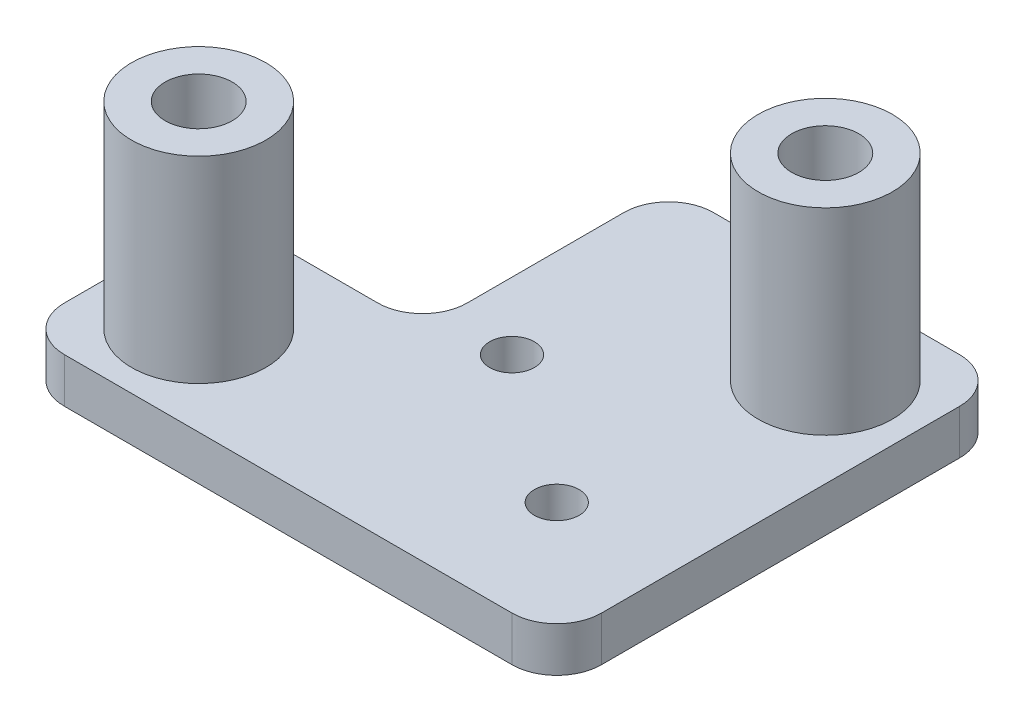
ISO-10303-21;
HEADER;
FILE_DESCRIPTION(('STEP AP214'),'2;1');
FILE_NAME('part.step','',(''),(''),'','','');
FILE_SCHEMA(('AUTOMOTIVE_DESIGN { 1 0 10303 214 1 1 1 1 }'));
ENDSEC;
DATA;
#1=APPLICATION_CONTEXT('core data for automotive mechanical design processes');
#2=APPLICATION_PROTOCOL_DEFINITION('international standard','automotive_design',2000,#1);
#3=PRODUCT_CONTEXT('',#1,'mechanical');
#4=PRODUCT('Part','Part','',(#3));
#5=PRODUCT_RELATED_PRODUCT_CATEGORY('part','',(#4));
#6=PRODUCT_DEFINITION_FORMATION('','',#4);
#7=PRODUCT_DEFINITION_CONTEXT('part definition',#1,'design');
#8=PRODUCT_DEFINITION('design','',#6,#7);
#9=PRODUCT_DEFINITION_SHAPE('','',#8);
#10=(LENGTH_UNIT() NAMED_UNIT(*) SI_UNIT(.MILLI.,.METRE.));
#11=(NAMED_UNIT(*) PLANE_ANGLE_UNIT() SI_UNIT($,.RADIAN.));
#12=(NAMED_UNIT(*) SI_UNIT($,.STERADIAN.) SOLID_ANGLE_UNIT());
#13=UNCERTAINTY_MEASURE_WITH_UNIT(LENGTH_MEASURE(1.E-05),#10,'distance_accuracy_value','');
#14=(GEOMETRIC_REPRESENTATION_CONTEXT(3) GLOBAL_UNCERTAINTY_ASSIGNED_CONTEXT((#13)) GLOBAL_UNIT_ASSIGNED_CONTEXT((#10,
#11,#12)) REPRESENTATION_CONTEXT('',''));
#15=CARTESIAN_POINT('',(0.,0.,0.));
#16=DIRECTION('',(0.,0.,1.));
#17=DIRECTION('',(1.,0.,0.));
#18=AXIS2_PLACEMENT_3D('',#15,#16,#17);
#19=CARTESIAN_POINT('',(3.08506617435395,7.48070483223529,16.5));
#20=DIRECTION('',(0.,1.,0.));
#21=DIRECTION('',(0.,0.,1.));
#22=AXIS2_PLACEMENT_3D('',#19,#20,#21);
#23=CYLINDRICAL_SURFACE('',#22,0.75);
#24=CARTESIAN_POINT('',(3.08506617435395,15.4807048322353,16.5));
#25=DIRECTION('',(0.,1.,0.));
#26=DIRECTION('',(0.,0.,1.));
#27=AXIS2_PLACEMENT_3D('',#24,#25,#26);
#28=CIRCLE('',#27,0.75);
#29=CARTESIAN_POINT('',(3.08506617435395,15.4807048322353,17.25));
#30=VERTEX_POINT('',#29);
#31=EDGE_CURVE('E210',#30,#30,#28,.F.);
#32=ORIENTED_EDGE('',*,*,#31,.F.);
#33=EDGE_LOOP('',(#32));
#34=FACE_BOUND('',#33,.T.);
#35=CARTESIAN_POINT('',(3.08506617435395,10.0807048322353,16.5));
#36=DIRECTION('',(0.,1.,0.));
#37=DIRECTION('',(0.,0.,1.));
#38=AXIS2_PLACEMENT_3D('',#35,#36,#37);
#39=CIRCLE('',#38,0.75);
#40=CARTESIAN_POINT('',(3.08506617435395,10.0807048322353,17.25));
#41=VERTEX_POINT('',#40);
#42=EDGE_CURVE('E19',#41,#41,#39,.T.);
#43=ORIENTED_EDGE('',*,*,#42,.F.);
#44=EDGE_LOOP('',(#43));
#45=FACE_BOUND('',#44,.T.);
#46=ADVANCED_FACE('F16',(#34,#45),#23,.F.);
#47=CARTESIAN_POINT('',(-4.91493382564604,7.48070483223529,22.5));
#48=DIRECTION('',(0.,1.,0.));
#49=DIRECTION('',(0.,0.,1.));
#50=AXIS2_PLACEMENT_3D('',#47,#48,#49);
#51=CYLINDRICAL_SURFACE('',#50,0.75);
#52=CARTESIAN_POINT('',(-4.91493382564604,15.4807048322353,22.5));
#53=DIRECTION('',(0.,1.,0.));
#54=DIRECTION('',(0.,0.,1.));
#55=AXIS2_PLACEMENT_3D('',#52,#53,#54);
#56=CIRCLE('',#55,0.75);
#57=CARTESIAN_POINT('',(-4.91493382564604,15.4807048322353,23.25));
#58=VERTEX_POINT('',#57);
#59=EDGE_CURVE('E142',#58,#58,#56,.F.);
#60=ORIENTED_EDGE('',*,*,#59,.F.);
#61=EDGE_LOOP('',(#60));
#62=FACE_BOUND('',#61,.T.);
#63=CARTESIAN_POINT('',(-4.91493382564604,10.0807048322353,22.5));
#64=DIRECTION('',(0.,1.,0.));
#65=DIRECTION('',(0.,0.,1.));
#66=AXIS2_PLACEMENT_3D('',#63,#64,#65);
#67=CIRCLE('',#66,0.75);
#68=CARTESIAN_POINT('',(-4.91493382564604,10.0807048322353,23.25));
#69=VERTEX_POINT('',#68);
#70=EDGE_CURVE('E212',#69,#69,#67,.T.);
#71=ORIENTED_EDGE('',*,*,#70,.F.);
#72=EDGE_LOOP('',(#71));
#73=FACE_BOUND('',#72,.T.);
#74=ADVANCED_FACE('F220',(#62,#73),#51,.F.);
#75=CARTESIAN_POINT('',(3.08506617435395,15.4807048322353,16.5));
#76=DIRECTION('',(0.,1.,0.));
#77=DIRECTION('',(0.,0.,1.));
#78=AXIS2_PLACEMENT_3D('',#75,#76,#77);
#79=PLANE('',#78);
#80=ORIENTED_EDGE('',*,*,#31,.T.);
#81=EDGE_LOOP('',(#80));
#82=FACE_BOUND('',#81,.T.);
#83=CARTESIAN_POINT('',(3.08506617435395,15.4807048322353,16.5));
#84=DIRECTION('',(0.,-1.,0.));
#85=DIRECTION('',(0.,0.,-1.));
#86=AXIS2_PLACEMENT_3D('',#83,#84,#85);
#87=CIRCLE('',#86,1.5);
#88=CARTESIAN_POINT('',(3.08506617435395,15.4807048322353,15.));
#89=VERTEX_POINT('',#88);
#90=EDGE_CURVE('E195',#89,#89,#87,.T.);
#91=ORIENTED_EDGE('',*,*,#90,.F.);
#92=EDGE_LOOP('',(#91));
#93=FACE_BOUND('',#92,.T.);
#94=ADVANCED_FACE('F226',(#82,#93),#79,.T.);
#95=CARTESIAN_POINT('',(-0.914933825646046,10.0807048322353,19.5));
#96=DIRECTION('',(0.,1.,0.));
#97=DIRECTION('',(0.,0.,1.));
#98=AXIS2_PLACEMENT_3D('',#95,#96,#97);
#99=PLANE('',#98);
#100=CARTESIAN_POINT('',(-0.914933825646046,10.0807048322353,19.5));
#101=DIRECTION('',(0.,1.,0.));
#102=DIRECTION('',(0.,0.,1.));
#103=AXIS2_PLACEMENT_3D('',#100,#101,#102);
#104=CIRCLE('',#103,0.5);
#105=CARTESIAN_POINT('',(-0.914933825646046,10.0807048322353,20.));
#106=VERTEX_POINT('',#105);
#107=EDGE_CURVE('E189',#106,#106,#104,.T.);
#108=ORIENTED_EDGE('',*,*,#107,.T.);
#109=EDGE_LOOP('',(#108));
#110=FACE_BOUND('',#109,.T.);
#111=CARTESIAN_POINT('',(2.44506617435396,10.0807048322353,21.86));
#112=DIRECTION('',(0.,1.,0.));
#113=DIRECTION('',(0.,0.,1.));
#114=AXIS2_PLACEMENT_3D('',#111,#112,#113);
#115=CIRCLE('',#114,0.5);
#116=CARTESIAN_POINT('',(2.44506617435396,10.0807048322353,22.36));
#117=VERTEX_POINT('',#116);
#118=EDGE_CURVE('E192',#117,#117,#115,.T.);
#119=ORIENTED_EDGE('',*,*,#118,.T.);
#120=EDGE_LOOP('',(#119));
#121=FACE_BOUND('',#120,.T.);
#122=CARTESIAN_POINT('',(-5.91493382564605,10.0807048322353,21.));
#123=DIRECTION('',(0.,-1.,0.));
#124=DIRECTION('',(0.,0.,-1.));
#125=AXIS2_PLACEMENT_3D('',#122,#123,#124);
#126=CIRCLE('',#125,1.);
#127=CARTESIAN_POINT('',(-5.91493382564605,10.0807048322353,20.));
#128=VERTEX_POINT('',#127);
#129=CARTESIAN_POINT('',(-6.91493382564604,10.0807048322353,21.));
#130=VERTEX_POINT('',#129);
#131=EDGE_CURVE('E111',#128,#130,#126,.F.);
#132=ORIENTED_EDGE('',*,*,#131,.F.);
#133=DIRECTION('',(1.,0.,0.));
#134=VECTOR('',#133,1.);
#135=CARTESIAN_POINT('',(-2.41493382564605,10.0807048322353,20.));
#136=LINE('',#135,#134);
#137=CARTESIAN_POINT('',(-3.41493382564605,10.0807048322353,20.));
#138=VERTEX_POINT('',#137);
#139=EDGE_CURVE('E102',#128,#138,#136,.T.);
#140=ORIENTED_EDGE('',*,*,#139,.T.);
#141=CARTESIAN_POINT('',(-3.41493382564605,10.0807048322353,19.));
#142=DIRECTION('',(0.,1.,0.));
#143=DIRECTION('',(0.,0.,1.));
#144=AXIS2_PLACEMENT_3D('',#141,#142,#143);
#145=CIRCLE('',#144,1.);
#146=CARTESIAN_POINT('',(-2.41493382564605,10.0807048322353,19.));
#147=VERTEX_POINT('',#146);
#148=EDGE_CURVE('E198',#138,#147,#145,.T.);
#149=ORIENTED_EDGE('',*,*,#148,.T.);
#150=DIRECTION('',(0.,0.,-1.));
#151=VECTOR('',#150,1.);
#152=CARTESIAN_POINT('',(-2.41493382564605,10.0807048322353,14.5));
#153=LINE('',#152,#151);
#154=CARTESIAN_POINT('',(-2.41493382564605,10.0807048322353,15.5));
#155=VERTEX_POINT('',#154);
#156=EDGE_CURVE('E136',#147,#155,#153,.T.);
#157=ORIENTED_EDGE('',*,*,#156,.T.);
#158=CARTESIAN_POINT('',(-1.41493382564605,10.0807048322353,15.5));
#159=DIRECTION('',(0.,-1.,0.));
#160=DIRECTION('',(0.,0.,-1.));
#161=AXIS2_PLACEMENT_3D('',#158,#159,#160);
#162=CIRCLE('',#161,1.);
#163=CARTESIAN_POINT('',(-1.41493382564605,10.0807048322353,14.5));
#164=VERTEX_POINT('',#163);
#165=EDGE_CURVE('E200',#164,#155,#162,.F.);
#166=ORIENTED_EDGE('',*,*,#165,.F.);
#167=DIRECTION('',(1.,0.,0.));
#168=VECTOR('',#167,1.);
#169=CARTESIAN_POINT('',(5.08506617435395,10.0807048322353,14.5));
#170=LINE('',#169,#168);
#171=CARTESIAN_POINT('',(4.08506617435395,10.0807048322353,14.5));
#172=VERTEX_POINT('',#171);
#173=EDGE_CURVE('E143',#164,#172,#170,.T.);
#174=ORIENTED_EDGE('',*,*,#173,.T.);
#175=CARTESIAN_POINT('',(4.08506617435395,10.0807048322353,15.5));
#176=DIRECTION('',(0.,-1.,0.));
#177=DIRECTION('',(0.,0.,-1.));
#178=AXIS2_PLACEMENT_3D('',#175,#176,#177);
#179=CIRCLE('',#178,1.);
#180=CARTESIAN_POINT('',(5.08506617435395,10.0807048322353,15.5));
#181=VERTEX_POINT('',#180);
#182=EDGE_CURVE('E202',#181,#172,#179,.F.);
#183=ORIENTED_EDGE('',*,*,#182,.F.);
#184=DIRECTION('',(0.,0.,1.));
#185=VECTOR('',#184,1.);
#186=CARTESIAN_POINT('',(5.08506617435396,10.0807048322353,24.5));
#187=LINE('',#186,#185);
#188=CARTESIAN_POINT('',(5.08506617435396,10.0807048322353,23.5));
#189=VERTEX_POINT('',#188);
#190=EDGE_CURVE('E148',#181,#189,#187,.T.);
#191=ORIENTED_EDGE('',*,*,#190,.T.);
#192=CARTESIAN_POINT('',(4.08506617435396,10.0807048322353,23.5));
#193=DIRECTION('',(0.,-1.,0.));
#194=DIRECTION('',(0.,0.,-1.));
#195=AXIS2_PLACEMENT_3D('',#192,#193,#194);
#196=CIRCLE('',#195,1.);
#197=CARTESIAN_POINT('',(4.08506617435396,10.0807048322353,24.5));
#198=VERTEX_POINT('',#197);
#199=EDGE_CURVE('E204',#198,#189,#196,.F.);
#200=ORIENTED_EDGE('',*,*,#199,.F.);
#201=DIRECTION('',(-1.,0.,0.));
#202=VECTOR('',#201,1.);
#203=CARTESIAN_POINT('',(5.08506617435396,10.0807048322353,24.5));
#204=LINE('',#203,#202);
#205=CARTESIAN_POINT('',(-5.91493382564604,10.0807048322353,24.5));
#206=VERTEX_POINT('',#205);
#207=EDGE_CURVE('E153',#198,#206,#204,.T.);
#208=ORIENTED_EDGE('',*,*,#207,.T.);
#209=CARTESIAN_POINT('',(-5.91493382564604,10.0807048322353,23.5));
#210=DIRECTION('',(0.,-1.,0.));
#211=DIRECTION('',(0.,0.,-1.));
#212=AXIS2_PLACEMENT_3D('',#209,#210,#211);
#213=CIRCLE('',#212,1.);
#214=CARTESIAN_POINT('',(-6.91493382564604,10.0807048322353,23.5));
#215=VERTEX_POINT('',#214);
#216=EDGE_CURVE('E114',#215,#206,#213,.F.);
#217=ORIENTED_EDGE('',*,*,#216,.F.);
#218=DIRECTION('',(0.,0.,-1.));
#219=VECTOR('',#218,1.);
#220=CARTESIAN_POINT('',(-6.91493382564604,10.0807048322353,24.5));
#221=LINE('',#220,#219);
#222=EDGE_CURVE('E107',#215,#130,#221,.T.);
#223=ORIENTED_EDGE('',*,*,#222,.T.);
#224=EDGE_LOOP('',(#132,#140,#149,#157,#166,#174,#183,#191,#200,#208,#217,#223));
#225=FACE_BOUND('',#224,.T.);
#226=ORIENTED_EDGE('',*,*,#42,.T.);
#227=EDGE_LOOP('',(#226));
#228=FACE_BOUND('',#227,.T.);
#229=ORIENTED_EDGE('',*,*,#70,.T.);
#230=EDGE_LOOP('',(#229));
#231=FACE_BOUND('',#230,.T.);
#232=ADVANCED_FACE('F109',(#110,#121,#225,#228,#231),#99,.F.);
#233=CARTESIAN_POINT('',(-4.91493382564604,15.4807048322353,22.5));
#234=DIRECTION('',(0.,1.,0.));
#235=DIRECTION('',(0.,0.,1.));
#236=AXIS2_PLACEMENT_3D('',#233,#234,#235);
#237=PLANE('',#236);
#238=ORIENTED_EDGE('',*,*,#59,.T.);
#239=EDGE_LOOP('',(#238));
#240=FACE_BOUND('',#239,.T.);
#241=CARTESIAN_POINT('',(-4.91493382564604,15.4807048322353,22.5));
#242=DIRECTION('',(0.,-1.,0.));
#243=DIRECTION('',(0.,0.,-1.));
#244=AXIS2_PLACEMENT_3D('',#241,#242,#243);
#245=CIRCLE('',#244,1.5);
#246=CARTESIAN_POINT('',(-4.91493382564604,15.4807048322353,21.));
#247=VERTEX_POINT('',#246);
#248=EDGE_CURVE('E186',#247,#247,#245,.T.);
#249=ORIENTED_EDGE('',*,*,#248,.F.);
#250=EDGE_LOOP('',(#249));
#251=FACE_BOUND('',#250,.T.);
#252=ADVANCED_FACE('F295',(#240,#251),#237,.T.);
#253=CARTESIAN_POINT('',(-2.41493382564605,11.0807048322353,20.));
#254=DIRECTION('',(0.,0.,1.));
#255=DIRECTION('',(1.,0.,0.));
#256=AXIS2_PLACEMENT_3D('',#253,#254,#255);
#257=PLANE('',#256);
#258=DIRECTION('',(0.,1.,0.));
#259=VECTOR('',#258,1.);
#260=CARTESIAN_POINT('',(-3.41493382564605,11.0807048322353,20.));
#261=LINE('',#260,#259);
#262=CARTESIAN_POINT('',(-3.41493382564605,11.0807048322353,20.));
#263=VERTEX_POINT('',#262);
#264=EDGE_CURVE('E139',#263,#138,#261,.F.);
#265=ORIENTED_EDGE('',*,*,#264,.T.);
#266=ORIENTED_EDGE('',*,*,#139,.F.);
#267=DIRECTION('',(0.,-1.,0.));
#268=VECTOR('',#267,1.);
#269=CARTESIAN_POINT('',(-5.91493382564605,11.0807048322353,20.));
#270=LINE('',#269,#268);
#271=CARTESIAN_POINT('',(-5.91493382564605,11.0807048322353,20.));
#272=VERTEX_POINT('',#271);
#273=EDGE_CURVE('E124',#272,#128,#270,.T.);
#274=ORIENTED_EDGE('',*,*,#273,.F.);
#275=DIRECTION('',(1.,0.,0.));
#276=VECTOR('',#275,1.);
#277=CARTESIAN_POINT('',(-0.914933825646046,11.0807048322353,20.));
#278=LINE('',#277,#276);
#279=EDGE_CURVE('E185',#263,#272,#278,.F.);
#280=ORIENTED_EDGE('',*,*,#279,.F.);
#281=EDGE_LOOP('',(#265,#266,#274,#280));
#282=FACE_BOUND('',#281,.T.);
#283=ADVANCED_FACE('F292',(#282),#257,.F.);
#284=CARTESIAN_POINT('',(-5.91493382564605,11.0807048322353,21.));
#285=DIRECTION('',(0.,-1.,0.));
#286=DIRECTION('',(0.,0.,-1.));
#287=AXIS2_PLACEMENT_3D('',#284,#285,#286);
#288=CYLINDRICAL_SURFACE('',#287,1.);
#289=ORIENTED_EDGE('',*,*,#131,.T.);
#290=DIRECTION('',(0.,1.,0.));
#291=VECTOR('',#290,1.);
#292=CARTESIAN_POINT('',(-6.91493382564604,11.0807048322353,21.));
#293=LINE('',#292,#291);
#294=CARTESIAN_POINT('',(-6.91493382564605,11.0807048322353,21.));
#295=VERTEX_POINT('',#294);
#296=EDGE_CURVE('E118',#130,#295,#293,.T.);
#297=ORIENTED_EDGE('',*,*,#296,.T.);
#298=CARTESIAN_POINT('',(-5.91493382564605,11.0807048322353,21.));
#299=DIRECTION('',(0.,-1.,0.));
#300=DIRECTION('',(0.,0.,-1.));
#301=AXIS2_PLACEMENT_3D('',#298,#299,#300);
#302=CIRCLE('',#301,1.);
#303=EDGE_CURVE('E183',#272,#295,#302,.F.);
#304=ORIENTED_EDGE('',*,*,#303,.F.);
#305=ORIENTED_EDGE('',*,*,#273,.T.);
#306=EDGE_LOOP('',(#289,#297,#304,#305));
#307=FACE_BOUND('',#306,.T.);
#308=ADVANCED_FACE('F121',(#307),#288,.T.);
#309=CARTESIAN_POINT('',(-6.91493382564604,11.0807048322353,24.5));
#310=DIRECTION('',(1.,0.,0.));
#311=DIRECTION('',(0.,0.,-1.));
#312=AXIS2_PLACEMENT_3D('',#309,#310,#311);
#313=PLANE('',#312);
#314=ORIENTED_EDGE('',*,*,#296,.F.);
#315=ORIENTED_EDGE('',*,*,#222,.F.);
#316=DIRECTION('',(0.,-1.,0.));
#317=VECTOR('',#316,1.);
#318=CARTESIAN_POINT('',(-6.91493382564604,11.0807048322353,23.5));
#319=LINE('',#318,#317);
#320=CARTESIAN_POINT('',(-6.91493382564604,11.0807048322353,23.5));
#321=VERTEX_POINT('',#320);
#322=EDGE_CURVE('E130',#321,#215,#319,.T.);
#323=ORIENTED_EDGE('',*,*,#322,.F.);
#324=DIRECTION('',(0.,0.,1.));
#325=VECTOR('',#324,1.);
#326=CARTESIAN_POINT('',(-6.91493382564605,11.0807048322353,19.5));
#327=LINE('',#326,#325);
#328=EDGE_CURVE('E128',#295,#321,#327,.T.);
#329=ORIENTED_EDGE('',*,*,#328,.F.);
#330=EDGE_LOOP('',(#314,#315,#323,#329));
#331=FACE_BOUND('',#330,.T.);
#332=ADVANCED_FACE('F126',(#331),#313,.F.);
#333=CARTESIAN_POINT('',(-5.91493382564604,11.0807048322353,23.5));
#334=DIRECTION('',(0.,-1.,0.));
#335=DIRECTION('',(0.,0.,-1.));
#336=AXIS2_PLACEMENT_3D('',#333,#334,#335);
#337=CYLINDRICAL_SURFACE('',#336,1.);
#338=ORIENTED_EDGE('',*,*,#216,.T.);
#339=DIRECTION('',(0.,1.,0.));
#340=VECTOR('',#339,1.);
#341=CARTESIAN_POINT('',(-5.91493382564604,11.0807048322353,24.5));
#342=LINE('',#341,#340);
#343=CARTESIAN_POINT('',(-5.91493382564604,11.0807048322353,24.5));
#344=VERTEX_POINT('',#343);
#345=EDGE_CURVE('E154',#206,#344,#342,.T.);
#346=ORIENTED_EDGE('',*,*,#345,.T.);
#347=CARTESIAN_POINT('',(-5.91493382564604,11.0807048322353,23.5));
#348=DIRECTION('',(0.,-1.,0.));
#349=DIRECTION('',(0.,0.,-1.));
#350=AXIS2_PLACEMENT_3D('',#347,#348,#349);
#351=CIRCLE('',#350,1.);
#352=EDGE_CURVE('E180',#321,#344,#351,.F.);
#353=ORIENTED_EDGE('',*,*,#352,.F.);
#354=ORIENTED_EDGE('',*,*,#322,.T.);
#355=EDGE_LOOP('',(#338,#346,#353,#354));
#356=FACE_BOUND('',#355,.T.);
#357=ADVANCED_FACE('F283',(#356),#337,.T.);
#358=CARTESIAN_POINT('',(5.08506617435396,11.0807048322353,24.5));
#359=DIRECTION('',(0.,0.,-1.));
#360=DIRECTION('',(-1.,0.,0.));
#361=AXIS2_PLACEMENT_3D('',#358,#359,#360);
#362=PLANE('',#361);
#363=ORIENTED_EDGE('',*,*,#345,.F.);
#364=ORIENTED_EDGE('',*,*,#207,.F.);
#365=DIRECTION('',(0.,-1.,0.));
#366=VECTOR('',#365,1.);
#367=CARTESIAN_POINT('',(4.08506617435396,11.0807048322353,24.5));
#368=LINE('',#367,#366);
#369=CARTESIAN_POINT('',(4.08506617435396,11.0807048322353,24.5));
#370=VERTEX_POINT('',#369);
#371=EDGE_CURVE('E206',#370,#198,#368,.T.);
#372=ORIENTED_EDGE('',*,*,#371,.F.);
#373=DIRECTION('',(1.,0.,0.));
#374=VECTOR('',#373,1.);
#375=CARTESIAN_POINT('',(-0.914933825646046,11.0807048322353,24.5));
#376=LINE('',#375,#374);
#377=EDGE_CURVE('E179',#344,#370,#376,.T.);
#378=ORIENTED_EDGE('',*,*,#377,.F.);
#379=EDGE_LOOP('',(#363,#364,#372,#378));
#380=FACE_BOUND('',#379,.T.);
#381=ADVANCED_FACE('F279',(#380),#362,.F.);
#382=CARTESIAN_POINT('',(4.08506617435396,11.0807048322353,23.5));
#383=DIRECTION('',(0.,-1.,0.));
#384=DIRECTION('',(0.,0.,-1.));
#385=AXIS2_PLACEMENT_3D('',#382,#383,#384);
#386=CYLINDRICAL_SURFACE('',#385,1.);
#387=ORIENTED_EDGE('',*,*,#199,.T.);
#388=DIRECTION('',(0.,1.,0.));
#389=VECTOR('',#388,1.);
#390=CARTESIAN_POINT('',(5.08506617435396,11.0807048322353,23.5));
#391=LINE('',#390,#389);
#392=CARTESIAN_POINT('',(5.08506617435396,11.0807048322353,23.5));
#393=VERTEX_POINT('',#392);
#394=EDGE_CURVE('E152',#189,#393,#391,.T.);
#395=ORIENTED_EDGE('',*,*,#394,.T.);
#396=CARTESIAN_POINT('',(4.08506617435396,11.0807048322353,23.5));
#397=DIRECTION('',(0.,-1.,0.));
#398=DIRECTION('',(0.,0.,-1.));
#399=AXIS2_PLACEMENT_3D('',#396,#397,#398);
#400=CIRCLE('',#399,1.);
#401=EDGE_CURVE('E176',#370,#393,#400,.F.);
#402=ORIENTED_EDGE('',*,*,#401,.F.);
#403=ORIENTED_EDGE('',*,*,#371,.T.);
#404=EDGE_LOOP('',(#387,#395,#402,#403));
#405=FACE_BOUND('',#404,.T.);
#406=ADVANCED_FACE('F275',(#405),#386,.T.);
#407=CARTESIAN_POINT('',(5.08506617435396,11.0807048322353,24.5));
#408=DIRECTION('',(-1.,0.,0.));
#409=DIRECTION('',(0.,0.,1.));
#410=AXIS2_PLACEMENT_3D('',#407,#408,#409);
#411=PLANE('',#410);
#412=DIRECTION('',(0.,-1.,0.));
#413=VECTOR('',#412,1.);
#414=CARTESIAN_POINT('',(5.08506617435395,11.0807048322353,15.5));
#415=LINE('',#414,#413);
#416=CARTESIAN_POINT('',(5.08506617435396,11.0807048322353,15.5));
#417=VERTEX_POINT('',#416);
#418=EDGE_CURVE('E151',#417,#181,#415,.T.);
#419=ORIENTED_EDGE('',*,*,#418,.F.);
#420=DIRECTION('',(0.,0.,1.));
#421=VECTOR('',#420,1.);
#422=CARTESIAN_POINT('',(5.08506617435396,11.0807048322353,19.5));
#423=LINE('',#422,#421);
#424=EDGE_CURVE('E175',#393,#417,#423,.F.);
#425=ORIENTED_EDGE('',*,*,#424,.F.);
#426=ORIENTED_EDGE('',*,*,#394,.F.);
#427=ORIENTED_EDGE('',*,*,#190,.F.);
#428=EDGE_LOOP('',(#419,#425,#426,#427));
#429=FACE_BOUND('',#428,.T.);
#430=ADVANCED_FACE('F271',(#429),#411,.F.);
#431=CARTESIAN_POINT('',(4.08506617435395,11.0807048322353,15.5));
#432=DIRECTION('',(0.,-1.,0.));
#433=DIRECTION('',(0.,0.,-1.));
#434=AXIS2_PLACEMENT_3D('',#431,#432,#433);
#435=CYLINDRICAL_SURFACE('',#434,1.);
#436=ORIENTED_EDGE('',*,*,#182,.T.);
#437=DIRECTION('',(0.,1.,0.));
#438=VECTOR('',#437,1.);
#439=CARTESIAN_POINT('',(4.08506617435395,11.0807048322353,14.5));
#440=LINE('',#439,#438);
#441=CARTESIAN_POINT('',(4.08506617435395,11.0807048322353,14.5));
#442=VERTEX_POINT('',#441);
#443=EDGE_CURVE('E147',#172,#442,#440,.T.);
#444=ORIENTED_EDGE('',*,*,#443,.T.);
#445=CARTESIAN_POINT('',(4.08506617435395,11.0807048322353,15.5));
#446=DIRECTION('',(0.,-1.,0.));
#447=DIRECTION('',(0.,0.,-1.));
#448=AXIS2_PLACEMENT_3D('',#445,#446,#447);
#449=CIRCLE('',#448,1.);
#450=EDGE_CURVE('E172',#417,#442,#449,.F.);
#451=ORIENTED_EDGE('',*,*,#450,.F.);
#452=ORIENTED_EDGE('',*,*,#418,.T.);
#453=EDGE_LOOP('',(#436,#444,#451,#452));
#454=FACE_BOUND('',#453,.T.);
#455=ADVANCED_FACE('F267',(#454),#435,.T.);
#456=CARTESIAN_POINT('',(5.08506617435395,11.0807048322353,14.5));
#457=DIRECTION('',(0.,0.,1.));
#458=DIRECTION('',(1.,0.,0.));
#459=AXIS2_PLACEMENT_3D('',#456,#457,#458);
#460=PLANE('',#459);
#461=DIRECTION('',(0.,-1.,0.));
#462=VECTOR('',#461,1.);
#463=CARTESIAN_POINT('',(-1.41493382564605,11.0807048322353,14.5));
#464=LINE('',#463,#462);
#465=CARTESIAN_POINT('',(-1.41493382564605,11.0807048322353,14.5));
#466=VERTEX_POINT('',#465);
#467=EDGE_CURVE('E146',#466,#164,#464,.T.);
#468=ORIENTED_EDGE('',*,*,#467,.F.);
#469=DIRECTION('',(1.,0.,0.));
#470=VECTOR('',#469,1.);
#471=CARTESIAN_POINT('',(-0.914933825646046,11.0807048322353,14.5));
#472=LINE('',#471,#470);
#473=EDGE_CURVE('E171',#442,#466,#472,.F.);
#474=ORIENTED_EDGE('',*,*,#473,.F.);
#475=ORIENTED_EDGE('',*,*,#443,.F.);
#476=ORIENTED_EDGE('',*,*,#173,.F.);
#477=EDGE_LOOP('',(#468,#474,#475,#476));
#478=FACE_BOUND('',#477,.T.);
#479=ADVANCED_FACE('F263',(#478),#460,.F.);
#480=CARTESIAN_POINT('',(-1.41493382564605,11.0807048322353,15.5));
#481=DIRECTION('',(0.,-1.,0.));
#482=DIRECTION('',(0.,0.,-1.));
#483=AXIS2_PLACEMENT_3D('',#480,#481,#482);
#484=CYLINDRICAL_SURFACE('',#483,1.);
#485=ORIENTED_EDGE('',*,*,#165,.T.);
#486=DIRECTION('',(0.,1.,0.));
#487=VECTOR('',#486,1.);
#488=CARTESIAN_POINT('',(-2.41493382564605,11.0807048322353,15.5));
#489=LINE('',#488,#487);
#490=CARTESIAN_POINT('',(-2.41493382564605,11.0807048322353,15.5));
#491=VERTEX_POINT('',#490);
#492=EDGE_CURVE('E140',#155,#491,#489,.T.);
#493=ORIENTED_EDGE('',*,*,#492,.T.);
#494=CARTESIAN_POINT('',(-1.41493382564605,11.0807048322353,15.5));
#495=DIRECTION('',(0.,-1.,0.));
#496=DIRECTION('',(0.,0.,-1.));
#497=AXIS2_PLACEMENT_3D('',#494,#495,#496);
#498=CIRCLE('',#497,1.);
#499=EDGE_CURVE('E168',#466,#491,#498,.F.);
#500=ORIENTED_EDGE('',*,*,#499,.F.);
#501=ORIENTED_EDGE('',*,*,#467,.T.);
#502=EDGE_LOOP('',(#485,#493,#500,#501));
#503=FACE_BOUND('',#502,.T.);
#504=ADVANCED_FACE('F260',(#503),#484,.T.);
#505=CARTESIAN_POINT('',(-2.41493382564605,11.0807048322353,14.5));
#506=DIRECTION('',(1.,0.,0.));
#507=DIRECTION('',(0.,0.,-1.));
#508=AXIS2_PLACEMENT_3D('',#505,#506,#507);
#509=PLANE('',#508);
#510=DIRECTION('',(0.,1.,0.));
#511=VECTOR('',#510,1.);
#512=CARTESIAN_POINT('',(-2.41493382564605,11.0807048322353,19.));
#513=LINE('',#512,#511);
#514=CARTESIAN_POINT('',(-2.41493382564605,11.0807048322353,19.));
#515=VERTEX_POINT('',#514);
#516=EDGE_CURVE('E34',#147,#515,#513,.T.);
#517=ORIENTED_EDGE('',*,*,#516,.T.);
#518=DIRECTION('',(0.,0.,1.));
#519=VECTOR('',#518,1.);
#520=CARTESIAN_POINT('',(-2.41493382564605,11.0807048322353,19.5));
#521=LINE('',#520,#519);
#522=EDGE_CURVE('E167',#491,#515,#521,.T.);
#523=ORIENTED_EDGE('',*,*,#522,.F.);
#524=ORIENTED_EDGE('',*,*,#492,.F.);
#525=ORIENTED_EDGE('',*,*,#156,.F.);
#526=EDGE_LOOP('',(#517,#523,#524,#525));
#527=FACE_BOUND('',#526,.T.);
#528=ADVANCED_FACE('F256',(#527),#509,.F.);
#529=CARTESIAN_POINT('',(-3.41493382564605,11.0807048322353,19.));
#530=DIRECTION('',(0.,1.,0.));
#531=DIRECTION('',(0.,0.,1.));
#532=AXIS2_PLACEMENT_3D('',#529,#530,#531);
#533=CYLINDRICAL_SURFACE('',#532,1.);
#534=ORIENTED_EDGE('',*,*,#516,.F.);
#535=ORIENTED_EDGE('',*,*,#148,.F.);
#536=ORIENTED_EDGE('',*,*,#264,.F.);
#537=CARTESIAN_POINT('',(-3.41493382564605,11.0807048322353,19.));
#538=DIRECTION('',(0.,1.,0.));
#539=DIRECTION('',(0.,0.,1.));
#540=AXIS2_PLACEMENT_3D('',#537,#538,#539);
#541=CIRCLE('',#540,1.);
#542=EDGE_CURVE('E164',#515,#263,#541,.F.);
#543=ORIENTED_EDGE('',*,*,#542,.F.);
#544=EDGE_LOOP('',(#534,#535,#536,#543));
#545=FACE_BOUND('',#544,.T.);
#546=ADVANCED_FACE('F252',(#545),#533,.F.);
#547=CARTESIAN_POINT('',(3.08506617435395,15.4807048322353,16.5));
#548=DIRECTION('',(0.,-1.,0.));
#549=DIRECTION('',(0.,0.,-1.));
#550=AXIS2_PLACEMENT_3D('',#547,#548,#549);
#551=CYLINDRICAL_SURFACE('',#550,1.5);
#552=ORIENTED_EDGE('',*,*,#90,.T.);
#553=EDGE_LOOP('',(#552));
#554=FACE_BOUND('',#553,.T.);
#555=CARTESIAN_POINT('',(3.08506617435395,11.0807048322353,16.5));
#556=DIRECTION('',(0.,-1.,0.));
#557=DIRECTION('',(0.,0.,-1.));
#558=AXIS2_PLACEMENT_3D('',#555,#556,#557);
#559=CIRCLE('',#558,1.5);
#560=CARTESIAN_POINT('',(3.08506617435395,11.0807048322353,15.));
#561=VERTEX_POINT('',#560);
#562=EDGE_CURVE('E161',#561,#561,#559,.T.);
#563=ORIENTED_EDGE('',*,*,#562,.F.);
#564=EDGE_LOOP('',(#563));
#565=FACE_BOUND('',#564,.T.);
#566=ADVANCED_FACE('F248',(#554,#565),#551,.T.);
#567=CARTESIAN_POINT('',(2.44506617435396,10.0807048322353,21.86));
#568=DIRECTION('',(0.,1.,0.));
#569=DIRECTION('',(0.,0.,1.));
#570=AXIS2_PLACEMENT_3D('',#567,#568,#569);
#571=CYLINDRICAL_SURFACE('',#570,0.5);
#572=CARTESIAN_POINT('',(2.44506617435396,11.0807048322353,21.86));
#573=DIRECTION('',(0.,1.,0.));
#574=DIRECTION('',(0.,0.,1.));
#575=AXIS2_PLACEMENT_3D('',#572,#573,#574);
#576=CIRCLE('',#575,0.5);
#577=CARTESIAN_POINT('',(2.44506617435396,11.0807048322353,22.36));
#578=VERTEX_POINT('',#577);
#579=EDGE_CURVE('E158',#578,#578,#576,.F.);
#580=ORIENTED_EDGE('',*,*,#579,.F.);
#581=EDGE_LOOP('',(#580));
#582=FACE_BOUND('',#581,.T.);
#583=ORIENTED_EDGE('',*,*,#118,.F.);
#584=EDGE_LOOP('',(#583));
#585=FACE_BOUND('',#584,.T.);
#586=ADVANCED_FACE('F244',(#582,#585),#571,.F.);
#587=CARTESIAN_POINT('',(-0.914933825646046,10.0807048322353,19.5));
#588=DIRECTION('',(0.,1.,0.));
#589=DIRECTION('',(0.,0.,1.));
#590=AXIS2_PLACEMENT_3D('',#587,#588,#589);
#591=CYLINDRICAL_SURFACE('',#590,0.5);
#592=CARTESIAN_POINT('',(-0.914933825646046,11.0807048322353,19.5));
#593=DIRECTION('',(0.,1.,0.));
#594=DIRECTION('',(0.,0.,1.));
#595=AXIS2_PLACEMENT_3D('',#592,#593,#594);
#596=CIRCLE('',#595,0.5);
#597=CARTESIAN_POINT('',(-0.914933825646046,11.0807048322353,20.));
#598=VERTEX_POINT('',#597);
#599=EDGE_CURVE('E25',#598,#598,#596,.F.);
#600=ORIENTED_EDGE('',*,*,#599,.F.);
#601=EDGE_LOOP('',(#600));
#602=FACE_BOUND('',#601,.T.);
#603=ORIENTED_EDGE('',*,*,#107,.F.);
#604=EDGE_LOOP('',(#603));
#605=FACE_BOUND('',#604,.T.);
#606=ADVANCED_FACE('F237',(#602,#605),#591,.F.);
#607=CARTESIAN_POINT('',(-4.91493382564604,15.4807048322353,22.5));
#608=DIRECTION('',(0.,-1.,0.));
#609=DIRECTION('',(0.,0.,-1.));
#610=AXIS2_PLACEMENT_3D('',#607,#608,#609);
#611=CYLINDRICAL_SURFACE('',#610,1.5);
#612=ORIENTED_EDGE('',*,*,#248,.T.);
#613=EDGE_LOOP('',(#612));
#614=FACE_BOUND('',#613,.T.);
#615=CARTESIAN_POINT('',(-4.91493382564604,11.0807048322353,22.5));
#616=DIRECTION('',(0.,-1.,0.));
#617=DIRECTION('',(0.,0.,-1.));
#618=AXIS2_PLACEMENT_3D('',#615,#616,#617);
#619=CIRCLE('',#618,1.5);
#620=CARTESIAN_POINT('',(-4.91493382564604,11.0807048322353,21.));
#621=VERTEX_POINT('',#620);
#622=EDGE_CURVE('E11',#621,#621,#619,.T.);
#623=ORIENTED_EDGE('',*,*,#622,.F.);
#624=EDGE_LOOP('',(#623));
#625=FACE_BOUND('',#624,.T.);
#626=ADVANCED_FACE('F231',(#614,#625),#611,.T.);
#627=CARTESIAN_POINT('',(-0.914933825646046,11.0807048322353,19.5));
#628=DIRECTION('',(0.,1.,0.));
#629=DIRECTION('',(0.,0.,1.));
#630=AXIS2_PLACEMENT_3D('',#627,#628,#629);
#631=PLANE('',#630);
#632=ORIENTED_EDGE('',*,*,#622,.T.);
#633=EDGE_LOOP('',(#632));
#634=FACE_BOUND('',#633,.T.);
#635=ORIENTED_EDGE('',*,*,#599,.T.);
#636=EDGE_LOOP('',(#635));
#637=FACE_BOUND('',#636,.T.);
#638=ORIENTED_EDGE('',*,*,#579,.T.);
#639=EDGE_LOOP('',(#638));
#640=FACE_BOUND('',#639,.T.);
#641=ORIENTED_EDGE('',*,*,#562,.T.);
#642=EDGE_LOOP('',(#641));
#643=FACE_BOUND('',#642,.T.);
#644=ORIENTED_EDGE('',*,*,#522,.T.);
#645=ORIENTED_EDGE('',*,*,#542,.T.);
#646=ORIENTED_EDGE('',*,*,#279,.T.);
#647=ORIENTED_EDGE('',*,*,#303,.T.);
#648=ORIENTED_EDGE('',*,*,#328,.T.);
#649=ORIENTED_EDGE('',*,*,#352,.T.);
#650=ORIENTED_EDGE('',*,*,#377,.T.);
#651=ORIENTED_EDGE('',*,*,#401,.T.);
#652=ORIENTED_EDGE('',*,*,#424,.T.);
#653=ORIENTED_EDGE('',*,*,#450,.T.);
#654=ORIENTED_EDGE('',*,*,#473,.T.);
#655=ORIENTED_EDGE('',*,*,#499,.T.);
#656=EDGE_LOOP('',(#644,#645,#646,#647,#648,#649,#650,#651,#652,#653,#654,#655));
#657=FACE_BOUND('',#656,.T.);
#658=ADVANCED_FACE('F229',(#634,#637,#640,#643,#657),#631,.T.);
#659=CLOSED_SHELL('',(#46,#74,#94,#232,#252,#283,#308,#332,#357,#381,#406,#430,#455,#479,#504,
#528,#546,#566,#586,#606,#626,#658));
#660=MANIFOLD_SOLID_BREP('B1',#659);
#661=ADVANCED_BREP_SHAPE_REPRESENTATION('',(#18,#660),#14);
#662=SHAPE_DEFINITION_REPRESENTATION(#9,#661);
ENDSEC;
END-ISO-10303-21;
